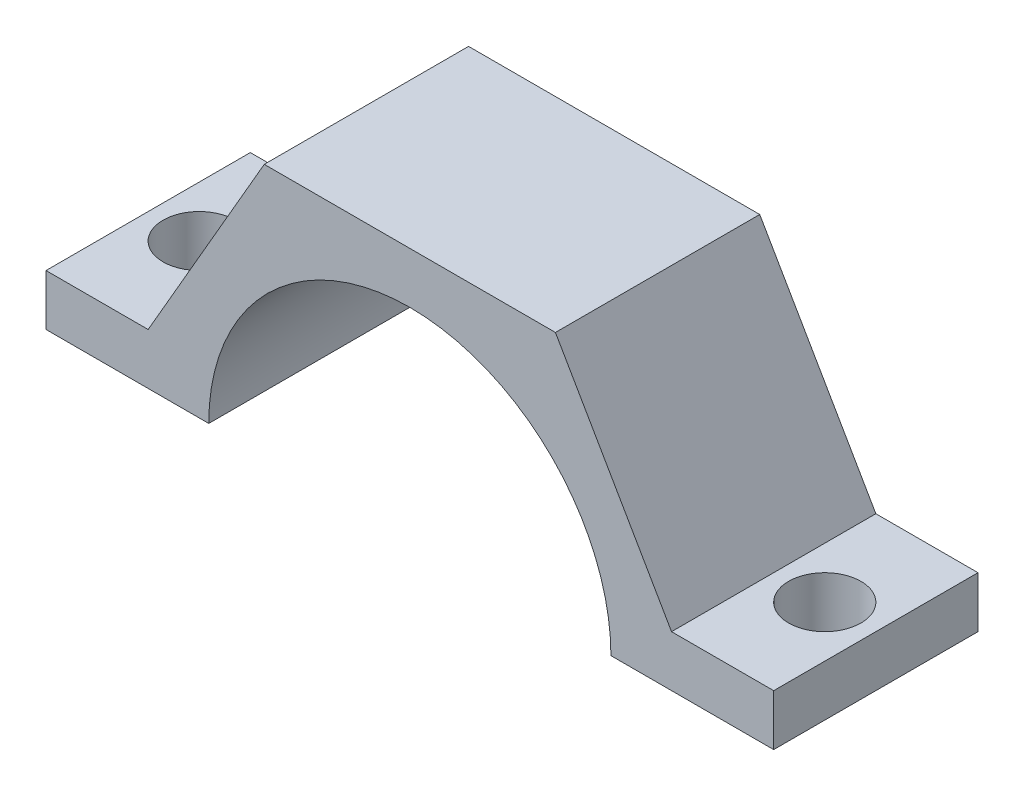
ISO-10303-21;
HEADER;
FILE_DESCRIPTION(('STEP AP214'),'2;1');
FILE_NAME('part.step','',(''),(''),'','','');
FILE_SCHEMA(('AUTOMOTIVE_DESIGN { 1 0 10303 214 1 1 1 1 }'));
ENDSEC;
DATA;
#1=APPLICATION_CONTEXT('core data for automotive mechanical design processes');
#2=APPLICATION_PROTOCOL_DEFINITION('international standard','automotive_design',2000,#1);
#3=PRODUCT_CONTEXT('',#1,'mechanical');
#4=PRODUCT('Part','Part','',(#3));
#5=PRODUCT_RELATED_PRODUCT_CATEGORY('part','',(#4));
#6=PRODUCT_DEFINITION_FORMATION('','',#4);
#7=PRODUCT_DEFINITION_CONTEXT('part definition',#1,'design');
#8=PRODUCT_DEFINITION('design','',#6,#7);
#9=PRODUCT_DEFINITION_SHAPE('','',#8);
#10=(LENGTH_UNIT() NAMED_UNIT(*) SI_UNIT(.MILLI.,.METRE.));
#11=(NAMED_UNIT(*) PLANE_ANGLE_UNIT() SI_UNIT($,.RADIAN.));
#12=(NAMED_UNIT(*) SI_UNIT($,.STERADIAN.) SOLID_ANGLE_UNIT());
#13=UNCERTAINTY_MEASURE_WITH_UNIT(LENGTH_MEASURE(1.E-05),#10,'distance_accuracy_value','');
#14=(GEOMETRIC_REPRESENTATION_CONTEXT(3) GLOBAL_UNCERTAINTY_ASSIGNED_CONTEXT((#13)) GLOBAL_UNIT_ASSIGNED_CONTEXT((#10,
#11,#12)) REPRESENTATION_CONTEXT('',''));
#15=CARTESIAN_POINT('',(0.,0.,0.));
#16=DIRECTION('',(0.,0.,1.));
#17=DIRECTION('',(1.,0.,0.));
#18=AXIS2_PLACEMENT_3D('',#15,#16,#17);
#19=CARTESIAN_POINT('',(0.,0.,12.7));
#20=DIRECTION('',(0.,0.,-1.));
#21=DIRECTION('',(-1.,0.,0.));
#22=AXIS2_PLACEMENT_3D('',#19,#20,#21);
#23=CYLINDRICAL_SURFACE('',#22,12.5);
#24=CARTESIAN_POINT('',(0.,0.,0.));
#25=DIRECTION('',(0.,0.,-1.));
#26=DIRECTION('',(1.,0.,0.));
#27=AXIS2_PLACEMENT_3D('',#24,#25,#26);
#28=CIRCLE('',#27,12.5);
#29=CARTESIAN_POINT('',(-12.5,0.,0.));
#30=VERTEX_POINT('',#29);
#31=CARTESIAN_POINT('',(12.5,0.,0.));
#32=VERTEX_POINT('',#31);
#33=EDGE_CURVE('E146',#30,#32,#28,.T.);
#34=ORIENTED_EDGE('',*,*,#33,.T.);
#35=DIRECTION('',(0.,0.,-1.));
#36=VECTOR('',#35,1.);
#37=CARTESIAN_POINT('',(12.5,0.,12.7));
#38=LINE('',#37,#36);
#39=CARTESIAN_POINT('',(12.5,0.,12.7));
#40=VERTEX_POINT('',#39);
#41=EDGE_CURVE('E11',#40,#32,#38,.T.);
#42=ORIENTED_EDGE('',*,*,#41,.F.);
#43=CARTESIAN_POINT('',(0.,0.,12.7));
#44=DIRECTION('',(0.,0.,-1.));
#45=DIRECTION('',(1.,0.,0.));
#46=AXIS2_PLACEMENT_3D('',#43,#44,#45);
#47=CIRCLE('',#46,12.5);
#48=CARTESIAN_POINT('',(-12.5,0.,12.7));
#49=VERTEX_POINT('',#48);
#50=EDGE_CURVE('E165',#49,#40,#47,.T.);
#51=ORIENTED_EDGE('',*,*,#50,.F.);
#52=DIRECTION('',(0.,0.,-1.));
#53=VECTOR('',#52,1.);
#54=CARTESIAN_POINT('',(-12.5,0.,12.7));
#55=LINE('',#54,#53);
#56=EDGE_CURVE('E142',#49,#30,#55,.T.);
#57=ORIENTED_EDGE('',*,*,#56,.T.);
#58=EDGE_LOOP('',(#34,#42,#51,#57));
#59=FACE_BOUND('',#58,.T.);
#60=ADVANCED_FACE('F38',(#59),#23,.F.);
#61=CARTESIAN_POINT('',(12.5,0.,12.7));
#62=DIRECTION('',(0.,1.,0.));
#63=DIRECTION('',(0.,0.,1.));
#64=AXIS2_PLACEMENT_3D('',#61,#62,#63);
#65=PLANE('',#64);
#66=CARTESIAN_POINT('',(19.4418438344177,0.,6.35));
#67=DIRECTION('',(0.,1.,0.));
#68=DIRECTION('',(0.,0.,1.));
#69=AXIS2_PLACEMENT_3D('',#66,#67,#68);
#70=CIRCLE('',#69,2.24789999999999);
#71=CARTESIAN_POINT('',(19.4418438344177,0.,8.59789999999999));
#72=VERTEX_POINT('',#71);
#73=EDGE_CURVE('E150',#72,#72,#70,.T.);
#74=ORIENTED_EDGE('',*,*,#73,.T.);
#75=EDGE_LOOP('',(#74));
#76=FACE_BOUND('',#75,.T.);
#77=DIRECTION('',(1.,0.,0.));
#78=VECTOR('',#77,1.);
#79=CARTESIAN_POINT('',(12.5,0.,0.));
#80=LINE('',#79,#78);
#81=CARTESIAN_POINT('',(22.6168438344177,0.,0.));
#82=VERTEX_POINT('',#81);
#83=EDGE_CURVE('E149',#32,#82,#80,.T.);
#84=ORIENTED_EDGE('',*,*,#83,.T.);
#85=DIRECTION('',(0.,0.,-1.));
#86=VECTOR('',#85,1.);
#87=CARTESIAN_POINT('',(22.6168438344177,0.,12.7));
#88=LINE('',#87,#86);
#89=CARTESIAN_POINT('',(22.6168438344177,0.,12.7));
#90=VERTEX_POINT('',#89);
#91=EDGE_CURVE('E46',#90,#82,#88,.T.);
#92=ORIENTED_EDGE('',*,*,#91,.F.);
#93=DIRECTION('',(1.,0.,0.));
#94=VECTOR('',#93,1.);
#95=CARTESIAN_POINT('',(12.5,0.,12.7));
#96=LINE('',#95,#94);
#97=EDGE_CURVE('E103',#40,#90,#96,.T.);
#98=ORIENTED_EDGE('',*,*,#97,.F.);
#99=ORIENTED_EDGE('',*,*,#41,.T.);
#100=EDGE_LOOP('',(#84,#92,#98,#99));
#101=FACE_BOUND('',#100,.T.);
#102=ADVANCED_FACE('F240',(#76,#101),#65,.F.);
#103=CARTESIAN_POINT('',(22.6168438344177,0.,12.7));
#104=DIRECTION('',(-1.,0.,0.));
#105=DIRECTION('',(0.,0.,1.));
#106=AXIS2_PLACEMENT_3D('',#103,#104,#105);
#107=PLANE('',#106);
#108=DIRECTION('',(0.,1.,0.));
#109=VECTOR('',#108,1.);
#110=CARTESIAN_POINT('',(22.6168438344177,0.,0.));
#111=LINE('',#110,#109);
#112=CARTESIAN_POINT('',(22.6168438344177,3.175,0.));
#113=VERTEX_POINT('',#112);
#114=EDGE_CURVE('E152',#82,#113,#111,.T.);
#115=ORIENTED_EDGE('',*,*,#114,.T.);
#116=DIRECTION('',(0.,0.,-1.));
#117=VECTOR('',#116,1.);
#118=CARTESIAN_POINT('',(22.6168438344177,3.175,12.7));
#119=LINE('',#118,#117);
#120=CARTESIAN_POINT('',(22.6168438344177,3.175,12.7));
#121=VERTEX_POINT('',#120);
#122=EDGE_CURVE('E178',#121,#113,#119,.T.);
#123=ORIENTED_EDGE('',*,*,#122,.F.);
#124=DIRECTION('',(0.,1.,0.));
#125=VECTOR('',#124,1.);
#126=CARTESIAN_POINT('',(22.6168438344177,0.,12.7));
#127=LINE('',#126,#125);
#128=EDGE_CURVE('E186',#90,#121,#127,.T.);
#129=ORIENTED_EDGE('',*,*,#128,.F.);
#130=ORIENTED_EDGE('',*,*,#91,.T.);
#131=EDGE_LOOP('',(#115,#123,#129,#130));
#132=FACE_BOUND('',#131,.T.);
#133=ADVANCED_FACE('F184',(#132),#107,.F.);
#134=CARTESIAN_POINT('',(22.6168438344177,3.175,12.7));
#135=DIRECTION('',(0.,-1.,0.));
#136=DIRECTION('',(1.,0.,0.));
#137=AXIS2_PLACEMENT_3D('',#134,#135,#136);
#138=PLANE('',#137);
#139=CARTESIAN_POINT('',(19.4418438344177,3.175,6.35));
#140=DIRECTION('',(0.,1.,0.));
#141=DIRECTION('',(0.,0.,1.));
#142=AXIS2_PLACEMENT_3D('',#139,#140,#141);
#143=CIRCLE('',#142,2.24789999999999);
#144=CARTESIAN_POINT('',(19.4418438344177,3.175,8.59789999999999));
#145=VERTEX_POINT('',#144);
#146=EDGE_CURVE('E214',#145,#145,#143,.T.);
#147=ORIENTED_EDGE('',*,*,#146,.F.);
#148=EDGE_LOOP('',(#147));
#149=FACE_BOUND('',#148,.T.);
#150=DIRECTION('',(-1.,0.,0.));
#151=VECTOR('',#150,1.);
#152=CARTESIAN_POINT('',(22.6168438344177,3.175,0.));
#153=LINE('',#152,#151);
#154=CARTESIAN_POINT('',(16.2668438344177,3.175,0.));
#155=VERTEX_POINT('',#154);
#156=EDGE_CURVE('E154',#113,#155,#153,.T.);
#157=ORIENTED_EDGE('',*,*,#156,.T.);
#158=DIRECTION('',(0.,0.,-1.));
#159=VECTOR('',#158,1.);
#160=CARTESIAN_POINT('',(16.2668438344177,3.175,12.7));
#161=LINE('',#160,#159);
#162=CARTESIAN_POINT('',(16.2668438344177,3.175,12.7));
#163=VERTEX_POINT('',#162);
#164=EDGE_CURVE('E175',#163,#155,#161,.T.);
#165=ORIENTED_EDGE('',*,*,#164,.F.);
#166=DIRECTION('',(-1.,0.,0.));
#167=VECTOR('',#166,1.);
#168=CARTESIAN_POINT('',(22.6168438344177,3.175,12.7));
#169=LINE('',#168,#167);
#170=EDGE_CURVE('E204',#121,#163,#169,.T.);
#171=ORIENTED_EDGE('',*,*,#170,.F.);
#172=ORIENTED_EDGE('',*,*,#122,.T.);
#173=EDGE_LOOP('',(#157,#165,#171,#172));
#174=FACE_BOUND('',#173,.T.);
#175=ADVANCED_FACE('F195',(#149,#174),#138,.F.);
#176=CARTESIAN_POINT('',(16.2668438344177,3.175,12.7));
#177=DIRECTION('',(-0.866025403784436,-0.500000000000004,0.));
#178=DIRECTION('',(0.500000000000004,-0.866025403784436,0.));
#179=AXIS2_PLACEMENT_3D('',#176,#177,#178);
#180=PLANE('',#179);
#181=DIRECTION('',(-0.500000000000004,0.866025403784436,0.));
#182=VECTOR('',#181,1.);
#183=CARTESIAN_POINT('',(16.2668438344177,3.175,0.));
#184=LINE('',#183,#182);
#185=CARTESIAN_POINT('',(9.04996546954734,15.675,0.));
#186=VERTEX_POINT('',#185);
#187=EDGE_CURVE('E156',#155,#186,#184,.T.);
#188=ORIENTED_EDGE('',*,*,#187,.T.);
#189=DIRECTION('',(0.,0.,-1.));
#190=VECTOR('',#189,1.);
#191=CARTESIAN_POINT('',(9.04996546954734,15.675,12.7));
#192=LINE('',#191,#190);
#193=CARTESIAN_POINT('',(9.04996546954734,15.675,12.7));
#194=VERTEX_POINT('',#193);
#195=EDGE_CURVE('E172',#194,#186,#192,.T.);
#196=ORIENTED_EDGE('',*,*,#195,.F.);
#197=DIRECTION('',(-0.500000000000004,0.866025403784436,0.));
#198=VECTOR('',#197,1.);
#199=CARTESIAN_POINT('',(16.2668438344177,3.175,12.7));
#200=LINE('',#199,#198);
#201=EDGE_CURVE('E201',#163,#194,#200,.T.);
#202=ORIENTED_EDGE('',*,*,#201,.F.);
#203=ORIENTED_EDGE('',*,*,#164,.T.);
#204=EDGE_LOOP('',(#188,#196,#202,#203));
#205=FACE_BOUND('',#204,.T.);
#206=ADVANCED_FACE('F199',(#205),#180,.F.);
#207=CARTESIAN_POINT('',(9.04996546954734,15.675,12.7));
#208=DIRECTION('',(0.,-1.,0.));
#209=DIRECTION('',(0.,0.,-1.));
#210=AXIS2_PLACEMENT_3D('',#207,#208,#209);
#211=PLANE('',#210);
#212=DIRECTION('',(-1.,0.,0.));
#213=VECTOR('',#212,1.);
#214=CARTESIAN_POINT('',(9.04996546954734,15.675,0.));
#215=LINE('',#214,#213);
#216=CARTESIAN_POINT('',(-9.04996546954734,15.675,0.));
#217=VERTEX_POINT('',#216);
#218=EDGE_CURVE('E158',#186,#217,#215,.T.);
#219=ORIENTED_EDGE('',*,*,#218,.T.);
#220=DIRECTION('',(0.,0.,-1.));
#221=VECTOR('',#220,1.);
#222=CARTESIAN_POINT('',(-9.04996546954734,15.675,12.7));
#223=LINE('',#222,#221);
#224=CARTESIAN_POINT('',(-9.04996546954734,15.675,12.7));
#225=VERTEX_POINT('',#224);
#226=EDGE_CURVE('E169',#225,#217,#223,.T.);
#227=ORIENTED_EDGE('',*,*,#226,.F.);
#228=DIRECTION('',(-1.,0.,0.));
#229=VECTOR('',#228,1.);
#230=CARTESIAN_POINT('',(9.04996546954734,15.675,12.7));
#231=LINE('',#230,#229);
#232=EDGE_CURVE('E203',#194,#225,#231,.T.);
#233=ORIENTED_EDGE('',*,*,#232,.F.);
#234=ORIENTED_EDGE('',*,*,#195,.T.);
#235=EDGE_LOOP('',(#219,#227,#233,#234));
#236=FACE_BOUND('',#235,.T.);
#237=ADVANCED_FACE('F236',(#236),#211,.F.);
#238=CARTESIAN_POINT('',(-9.04996546954734,15.675,12.7));
#239=DIRECTION('',(0.866025403784436,-0.500000000000004,0.));
#240=DIRECTION('',(0.500000000000004,0.866025403784436,0.));
#241=AXIS2_PLACEMENT_3D('',#238,#239,#240);
#242=PLANE('',#241);
#243=DIRECTION('',(-0.500000000000004,-0.866025403784436,0.));
#244=VECTOR('',#243,1.);
#245=CARTESIAN_POINT('',(-9.04996546954734,15.675,0.));
#246=LINE('',#245,#244);
#247=CARTESIAN_POINT('',(-16.2668438344177,3.175,0.));
#248=VERTEX_POINT('',#247);
#249=EDGE_CURVE('E160',#217,#248,#246,.T.);
#250=ORIENTED_EDGE('',*,*,#249,.T.);
#251=DIRECTION('',(0.,0.,-1.));
#252=VECTOR('',#251,1.);
#253=CARTESIAN_POINT('',(-16.2668438344177,3.175,12.7));
#254=LINE('',#253,#252);
#255=CARTESIAN_POINT('',(-16.2668438344177,3.175,12.7));
#256=VERTEX_POINT('',#255);
#257=EDGE_CURVE('E137',#256,#248,#254,.T.);
#258=ORIENTED_EDGE('',*,*,#257,.F.);
#259=DIRECTION('',(-0.500000000000004,-0.866025403784436,0.));
#260=VECTOR('',#259,1.);
#261=CARTESIAN_POINT('',(-9.04996546954734,15.675,12.7));
#262=LINE('',#261,#260);
#263=EDGE_CURVE('E128',#225,#256,#262,.T.);
#264=ORIENTED_EDGE('',*,*,#263,.F.);
#265=ORIENTED_EDGE('',*,*,#226,.T.);
#266=EDGE_LOOP('',(#250,#258,#264,#265));
#267=FACE_BOUND('',#266,.T.);
#268=ADVANCED_FACE('F228',(#267),#242,.F.);
#269=CARTESIAN_POINT('',(-16.2668438344177,3.175,12.7));
#270=DIRECTION('',(0.,-1.,0.));
#271=DIRECTION('',(1.,0.,0.));
#272=AXIS2_PLACEMENT_3D('',#269,#270,#271);
#273=PLANE('',#272);
#274=CARTESIAN_POINT('',(-19.4418438344177,3.175,6.35));
#275=DIRECTION('',(0.,1.,0.));
#276=DIRECTION('',(0.,0.,1.));
#277=AXIS2_PLACEMENT_3D('',#274,#275,#276);
#278=CIRCLE('',#277,2.24789999999999);
#279=CARTESIAN_POINT('',(-19.4418438344177,3.175,8.59789999999999));
#280=VERTEX_POINT('',#279);
#281=EDGE_CURVE('E220',#280,#280,#278,.T.);
#282=ORIENTED_EDGE('',*,*,#281,.F.);
#283=EDGE_LOOP('',(#282));
#284=FACE_BOUND('',#283,.T.);
#285=DIRECTION('',(-1.,0.,0.));
#286=VECTOR('',#285,1.);
#287=CARTESIAN_POINT('',(-16.2668438344177,3.175,0.));
#288=LINE('',#287,#286);
#289=CARTESIAN_POINT('',(-22.6168438344177,3.175,0.));
#290=VERTEX_POINT('',#289);
#291=EDGE_CURVE('E136',#248,#290,#288,.T.);
#292=ORIENTED_EDGE('',*,*,#291,.T.);
#293=DIRECTION('',(0.,0.,-1.));
#294=VECTOR('',#293,1.);
#295=CARTESIAN_POINT('',(-22.6168438344177,3.175,12.7));
#296=LINE('',#295,#294);
#297=CARTESIAN_POINT('',(-22.6168438344177,3.175,12.7));
#298=VERTEX_POINT('',#297);
#299=EDGE_CURVE('E133',#298,#290,#296,.T.);
#300=ORIENTED_EDGE('',*,*,#299,.F.);
#301=DIRECTION('',(-1.,0.,0.));
#302=VECTOR('',#301,1.);
#303=CARTESIAN_POINT('',(-16.2668438344177,3.175,12.7));
#304=LINE('',#303,#302);
#305=EDGE_CURVE('E122',#256,#298,#304,.T.);
#306=ORIENTED_EDGE('',*,*,#305,.F.);
#307=ORIENTED_EDGE('',*,*,#257,.T.);
#308=EDGE_LOOP('',(#292,#300,#306,#307));
#309=FACE_BOUND('',#308,.T.);
#310=ADVANCED_FACE('F134',(#284,#309),#273,.F.);
#311=CARTESIAN_POINT('',(-22.6168438344177,3.175,12.7));
#312=DIRECTION('',(1.,0.,0.));
#313=DIRECTION('',(0.,0.,-1.));
#314=AXIS2_PLACEMENT_3D('',#311,#312,#313);
#315=PLANE('',#314);
#316=DIRECTION('',(0.,-1.,0.));
#317=VECTOR('',#316,1.);
#318=CARTESIAN_POINT('',(-22.6168438344177,3.175,0.));
#319=LINE('',#318,#317);
#320=CARTESIAN_POINT('',(-22.6168438344177,0.,0.));
#321=VERTEX_POINT('',#320);
#322=EDGE_CURVE('E89',#290,#321,#319,.T.);
#323=ORIENTED_EDGE('',*,*,#322,.T.);
#324=DIRECTION('',(0.,0.,-1.));
#325=VECTOR('',#324,1.);
#326=CARTESIAN_POINT('',(-22.6168438344177,0.,12.7));
#327=LINE('',#326,#325);
#328=CARTESIAN_POINT('',(-22.6168438344177,0.,12.7));
#329=VERTEX_POINT('',#328);
#330=EDGE_CURVE('E138',#329,#321,#327,.T.);
#331=ORIENTED_EDGE('',*,*,#330,.F.);
#332=DIRECTION('',(0.,-1.,0.));
#333=VECTOR('',#332,1.);
#334=CARTESIAN_POINT('',(-22.6168438344177,3.175,12.7));
#335=LINE('',#334,#333);
#336=EDGE_CURVE('E126',#298,#329,#335,.T.);
#337=ORIENTED_EDGE('',*,*,#336,.F.);
#338=ORIENTED_EDGE('',*,*,#299,.T.);
#339=EDGE_LOOP('',(#323,#331,#337,#338));
#340=FACE_BOUND('',#339,.T.);
#341=ADVANCED_FACE('F140',(#340),#315,.F.);
#342=CARTESIAN_POINT('',(-22.6168438344177,0.,12.7));
#343=DIRECTION('',(0.,1.,0.));
#344=DIRECTION('',(0.,0.,1.));
#345=AXIS2_PLACEMENT_3D('',#342,#343,#344);
#346=PLANE('',#345);
#347=CARTESIAN_POINT('',(-19.4418438344177,0.,6.35));
#348=DIRECTION('',(0.,1.,0.));
#349=DIRECTION('',(0.,0.,1.));
#350=AXIS2_PLACEMENT_3D('',#347,#348,#349);
#351=CIRCLE('',#350,2.24789999999999);
#352=CARTESIAN_POINT('',(-19.4418438344177,0.,8.59789999999999));
#353=VERTEX_POINT('',#352);
#354=EDGE_CURVE('E217',#353,#353,#351,.T.);
#355=ORIENTED_EDGE('',*,*,#354,.T.);
#356=EDGE_LOOP('',(#355));
#357=FACE_BOUND('',#356,.T.);
#358=DIRECTION('',(1.,0.,0.));
#359=VECTOR('',#358,1.);
#360=CARTESIAN_POINT('',(-22.6168438344177,0.,0.));
#361=LINE('',#360,#359);
#362=EDGE_CURVE('E95',#321,#30,#361,.T.);
#363=ORIENTED_EDGE('',*,*,#362,.T.);
#364=ORIENTED_EDGE('',*,*,#56,.F.);
#365=DIRECTION('',(1.,0.,0.));
#366=VECTOR('',#365,1.);
#367=CARTESIAN_POINT('',(-22.6168438344177,0.,12.7));
#368=LINE('',#367,#366);
#369=EDGE_CURVE('E54',#329,#49,#368,.T.);
#370=ORIENTED_EDGE('',*,*,#369,.F.);
#371=ORIENTED_EDGE('',*,*,#330,.T.);
#372=EDGE_LOOP('',(#363,#364,#370,#371));
#373=FACE_BOUND('',#372,.T.);
#374=ADVANCED_FACE('F234',(#357,#373),#346,.F.);
#375=CARTESIAN_POINT('',(0.,0.,12.7));
#376=DIRECTION('',(0.,0.,1.));
#377=DIRECTION('',(1.,0.,0.));
#378=AXIS2_PLACEMENT_3D('',#375,#376,#377);
#379=PLANE('',#378);
#380=ORIENTED_EDGE('',*,*,#50,.T.);
#381=ORIENTED_EDGE('',*,*,#97,.T.);
#382=ORIENTED_EDGE('',*,*,#128,.T.);
#383=ORIENTED_EDGE('',*,*,#170,.T.);
#384=ORIENTED_EDGE('',*,*,#201,.T.);
#385=ORIENTED_EDGE('',*,*,#232,.T.);
#386=ORIENTED_EDGE('',*,*,#263,.T.);
#387=ORIENTED_EDGE('',*,*,#305,.T.);
#388=ORIENTED_EDGE('',*,*,#336,.T.);
#389=ORIENTED_EDGE('',*,*,#369,.T.);
#390=EDGE_LOOP('',(#380,#381,#382,#383,#384,#385,#386,#387,#388,#389));
#391=FACE_BOUND('',#390,.T.);
#392=ADVANCED_FACE('F124',(#391),#379,.T.);
#393=CARTESIAN_POINT('',(0.,0.,0.));
#394=DIRECTION('',(0.,0.,1.));
#395=DIRECTION('',(1.,0.,0.));
#396=AXIS2_PLACEMENT_3D('',#393,#394,#395);
#397=PLANE('',#396);
#398=ORIENTED_EDGE('',*,*,#33,.F.);
#399=ORIENTED_EDGE('',*,*,#362,.F.);
#400=ORIENTED_EDGE('',*,*,#322,.F.);
#401=ORIENTED_EDGE('',*,*,#291,.F.);
#402=ORIENTED_EDGE('',*,*,#249,.F.);
#403=ORIENTED_EDGE('',*,*,#218,.F.);
#404=ORIENTED_EDGE('',*,*,#187,.F.);
#405=ORIENTED_EDGE('',*,*,#156,.F.);
#406=ORIENTED_EDGE('',*,*,#114,.F.);
#407=ORIENTED_EDGE('',*,*,#83,.F.);
#408=EDGE_LOOP('',(#398,#399,#400,#401,#402,#403,#404,#405,#406,#407));
#409=FACE_BOUND('',#408,.T.);
#410=ADVANCED_FACE('F190',(#409),#397,.F.);
#411=CARTESIAN_POINT('',(19.4418438344177,3.175,6.35));
#412=DIRECTION('',(0.,1.,0.));
#413=DIRECTION('',(0.,0.,1.));
#414=AXIS2_PLACEMENT_3D('',#411,#412,#413);
#415=CYLINDRICAL_SURFACE('',#414,2.24789999999999);
#416=ORIENTED_EDGE('',*,*,#146,.T.);
#417=EDGE_LOOP('',(#416));
#418=FACE_BOUND('',#417,.T.);
#419=ORIENTED_EDGE('',*,*,#73,.F.);
#420=EDGE_LOOP('',(#419));
#421=FACE_BOUND('',#420,.T.);
#422=ADVANCED_FACE('F309',(#418,#421),#415,.F.);
#423=CARTESIAN_POINT('',(-19.4418438344177,3.175,6.35));
#424=DIRECTION('',(0.,1.,0.));
#425=DIRECTION('',(0.,0.,1.));
#426=AXIS2_PLACEMENT_3D('',#423,#424,#425);
#427=CYLINDRICAL_SURFACE('',#426,2.24789999999999);
#428=ORIENTED_EDGE('',*,*,#281,.T.);
#429=EDGE_LOOP('',(#428));
#430=FACE_BOUND('',#429,.T.);
#431=ORIENTED_EDGE('',*,*,#354,.F.);
#432=EDGE_LOOP('',(#431));
#433=FACE_BOUND('',#432,.T.);
#434=ADVANCED_FACE('F224',(#430,#433),#427,.F.);
#435=CLOSED_SHELL('',(#60,#102,#133,#175,#206,#237,#268,#310,#341,#374,#392,#410,#422,#434));
#436=MANIFOLD_SOLID_BREP('B2',#435);
#437=ADVANCED_BREP_SHAPE_REPRESENTATION('',(#18,#436),#14);
#438=SHAPE_DEFINITION_REPRESENTATION(#9,#437);
ENDSEC;
END-ISO-10303-21;
